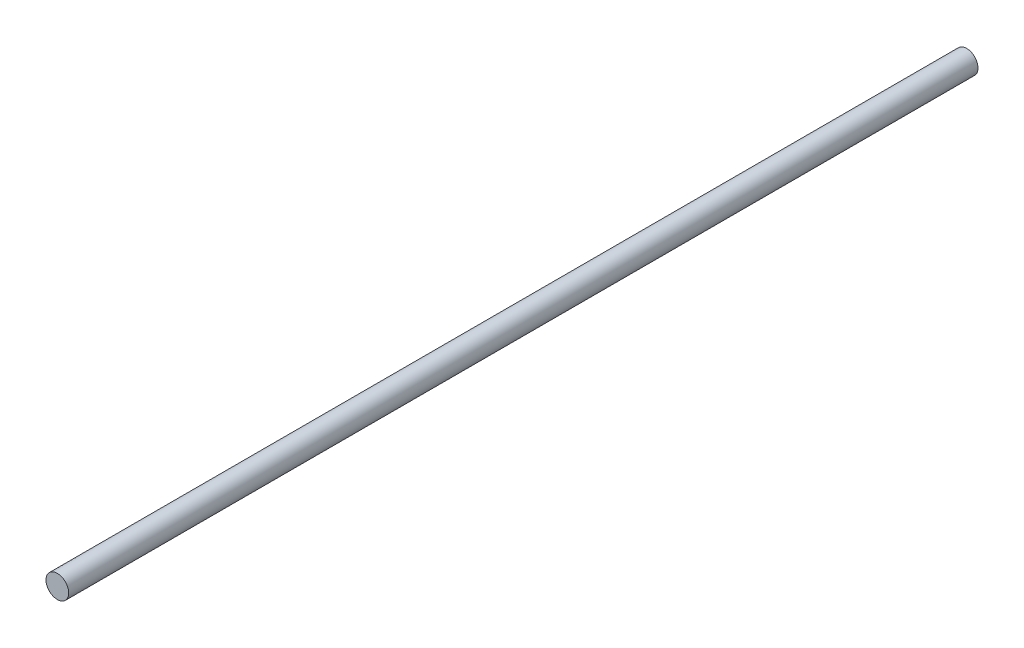
ISO-10303-21;
HEADER;
FILE_DESCRIPTION(('STEP AP214'),'2;1');
FILE_NAME('part.step','',(''),(''),'','','');
FILE_SCHEMA(('AUTOMOTIVE_DESIGN { 1 0 10303 214 1 1 1 1 }'));
ENDSEC;
DATA;
#1=APPLICATION_CONTEXT('core data for automotive mechanical design processes');
#2=APPLICATION_PROTOCOL_DEFINITION('international standard','automotive_design',2000,#1);
#3=PRODUCT_CONTEXT('',#1,'mechanical');
#4=PRODUCT('Part','Part','',(#3));
#5=PRODUCT_RELATED_PRODUCT_CATEGORY('part','',(#4));
#6=PRODUCT_DEFINITION_FORMATION('','',#4);
#7=PRODUCT_DEFINITION_CONTEXT('part definition',#1,'design');
#8=PRODUCT_DEFINITION('design','',#6,#7);
#9=PRODUCT_DEFINITION_SHAPE('','',#8);
#10=(LENGTH_UNIT() NAMED_UNIT(*) SI_UNIT(.MILLI.,.METRE.));
#11=(NAMED_UNIT(*) PLANE_ANGLE_UNIT() SI_UNIT($,.RADIAN.));
#12=(NAMED_UNIT(*) SI_UNIT($,.STERADIAN.) SOLID_ANGLE_UNIT());
#13=UNCERTAINTY_MEASURE_WITH_UNIT(LENGTH_MEASURE(1.E-05),#10,'distance_accuracy_value','');
#14=(GEOMETRIC_REPRESENTATION_CONTEXT(3) GLOBAL_UNCERTAINTY_ASSIGNED_CONTEXT((#13)) GLOBAL_UNIT_ASSIGNED_CONTEXT((#10,
#11,#12)) REPRESENTATION_CONTEXT('',''));
#15=CARTESIAN_POINT('',(0.,0.,0.));
#16=DIRECTION('',(0.,0.,1.));
#17=DIRECTION('',(1.,0.,0.));
#18=AXIS2_PLACEMENT_3D('',#15,#16,#17);
#19=CARTESIAN_POINT('',(0.,0.,95.25));
#20=DIRECTION('',(0.,0.,-1.));
#21=DIRECTION('',(-1.,0.,0.));
#22=AXIS2_PLACEMENT_3D('',#19,#20,#21);
#23=CYLINDRICAL_SURFACE('',#22,1.190625);
#24=CARTESIAN_POINT('',(0.,0.,95.25));
#25=DIRECTION('',(0.,0.,1.));
#26=DIRECTION('',(1.,0.,0.));
#27=AXIS2_PLACEMENT_3D('',#24,#25,#26);
#28=CIRCLE('',#27,1.190625);
#29=CARTESIAN_POINT('',(1.190625,0.,95.25));
#30=VERTEX_POINT('',#29);
#31=EDGE_CURVE('E10',#30,#30,#28,.T.);
#32=ORIENTED_EDGE('',*,*,#31,.F.);
#33=EDGE_LOOP('',(#32));
#34=FACE_BOUND('',#33,.T.);
#35=CARTESIAN_POINT('',(0.,0.,0.));
#36=DIRECTION('',(0.,0.,1.));
#37=DIRECTION('',(1.,0.,0.));
#38=AXIS2_PLACEMENT_3D('',#35,#36,#37);
#39=CIRCLE('',#38,1.190625);
#40=CARTESIAN_POINT('',(1.190625,0.,0.));
#41=VERTEX_POINT('',#40);
#42=EDGE_CURVE('E48',#41,#41,#39,.T.);
#43=ORIENTED_EDGE('',*,*,#42,.T.);
#44=EDGE_LOOP('',(#43));
#45=FACE_BOUND('',#44,.T.);
#46=ADVANCED_FACE('F45',(#34,#45),#23,.T.);
#47=CARTESIAN_POINT('',(0.,0.,95.25));
#48=DIRECTION('',(0.,0.,1.));
#49=DIRECTION('',(1.,0.,0.));
#50=AXIS2_PLACEMENT_3D('',#47,#48,#49);
#51=PLANE('',#50);
#52=ORIENTED_EDGE('',*,*,#31,.T.);
#53=EDGE_LOOP('',(#52));
#54=FACE_BOUND('',#53,.T.);
#55=ADVANCED_FACE('F62',(#54),#51,.T.);
#56=CARTESIAN_POINT('',(0.,0.,0.));
#57=DIRECTION('',(0.,0.,1.));
#58=DIRECTION('',(1.,0.,0.));
#59=AXIS2_PLACEMENT_3D('',#56,#57,#58);
#60=PLANE('',#59);
#61=ORIENTED_EDGE('',*,*,#42,.F.);
#62=EDGE_LOOP('',(#61));
#63=FACE_BOUND('',#62,.T.);
#64=ADVANCED_FACE('F60',(#63),#60,.F.);
#65=CLOSED_SHELL('',(#46,#55,#64));
#66=MANIFOLD_SOLID_BREP('B2',#65);
#67=ADVANCED_BREP_SHAPE_REPRESENTATION('',(#18,#66),#14);
#68=SHAPE_DEFINITION_REPRESENTATION(#9,#67);
ENDSEC;
END-ISO-10303-21;
